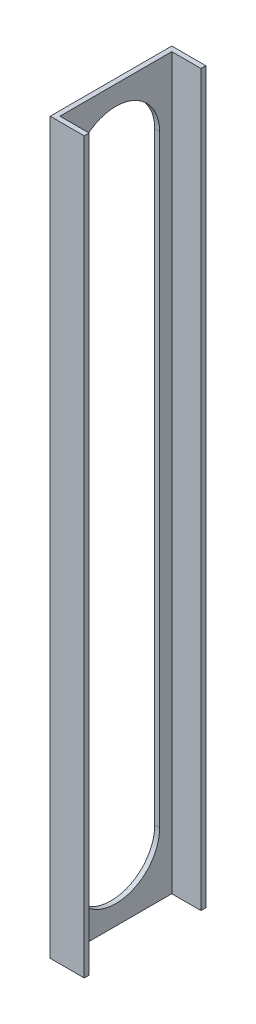
ISO-10303-21;
HEADER;
FILE_DESCRIPTION(('STEP AP214'),'2;1');
FILE_NAME('part.step','',(''),(''),'','','');
FILE_SCHEMA(('AUTOMOTIVE_DESIGN { 1 0 10303 214 1 1 1 1 }'));
ENDSEC;
DATA;
#1=APPLICATION_CONTEXT('core data for automotive mechanical design processes');
#2=APPLICATION_PROTOCOL_DEFINITION('international standard','automotive_design',2000,#1);
#3=PRODUCT_CONTEXT('',#1,'mechanical');
#4=PRODUCT('Part','Part','',(#3));
#5=PRODUCT_RELATED_PRODUCT_CATEGORY('part','',(#4));
#6=PRODUCT_DEFINITION_FORMATION('','',#4);
#7=PRODUCT_DEFINITION_CONTEXT('part definition',#1,'design');
#8=PRODUCT_DEFINITION('design','',#6,#7);
#9=PRODUCT_DEFINITION_SHAPE('','',#8);
#10=(LENGTH_UNIT() NAMED_UNIT(*) SI_UNIT(.MILLI.,.METRE.));
#11=(NAMED_UNIT(*) PLANE_ANGLE_UNIT() SI_UNIT($,.RADIAN.));
#12=(NAMED_UNIT(*) SI_UNIT($,.STERADIAN.) SOLID_ANGLE_UNIT());
#13=UNCERTAINTY_MEASURE_WITH_UNIT(LENGTH_MEASURE(1.E-05),#10,'distance_accuracy_value','');
#14=(GEOMETRIC_REPRESENTATION_CONTEXT(3) GLOBAL_UNCERTAINTY_ASSIGNED_CONTEXT((#13)) GLOBAL_UNIT_ASSIGNED_CONTEXT((#10,
#11,#12)) REPRESENTATION_CONTEXT('',''));
#15=CARTESIAN_POINT('',(0.,0.,0.));
#16=DIRECTION('',(0.,0.,1.));
#17=DIRECTION('',(1.,0.,0.));
#18=AXIS2_PLACEMENT_3D('',#15,#16,#17);
#19=CARTESIAN_POINT('',(0.,300.,0.));
#20=DIRECTION('',(0.,0.,-1.));
#21=DIRECTION('',(-1.,0.,0.));
#22=AXIS2_PLACEMENT_3D('',#19,#20,#21);
#23=PLANE('',#22);
#24=DIRECTION('',(1.,0.,0.));
#25=VECTOR('',#24,1.);
#26=CARTESIAN_POINT('',(0.,0.,0.));
#27=LINE('',#26,#25);
#28=CARTESIAN_POINT('',(0.,0.,0.));
#29=VERTEX_POINT('',#28);
#30=CARTESIAN_POINT('',(14.,0.,0.));
#31=VERTEX_POINT('',#30);
#32=EDGE_CURVE('E160',#29,#31,#27,.T.);
#33=ORIENTED_EDGE('',*,*,#32,.T.);
#34=DIRECTION('',(0.,-1.,0.));
#35=VECTOR('',#34,1.);
#36=CARTESIAN_POINT('',(14.,300.,0.));
#37=LINE('',#36,#35);
#38=CARTESIAN_POINT('',(14.,300.,0.));
#39=VERTEX_POINT('',#38);
#40=EDGE_CURVE('E11',#39,#31,#37,.T.);
#41=ORIENTED_EDGE('',*,*,#40,.F.);
#42=DIRECTION('',(1.,0.,0.));
#43=VECTOR('',#42,1.);
#44=CARTESIAN_POINT('',(0.,300.,0.));
#45=LINE('',#44,#43);
#46=CARTESIAN_POINT('',(0.,300.,0.));
#47=VERTEX_POINT('',#46);
#48=EDGE_CURVE('E161',#47,#39,#45,.T.);
#49=ORIENTED_EDGE('',*,*,#48,.F.);
#50=DIRECTION('',(0.,-1.,0.));
#51=VECTOR('',#50,1.);
#52=CARTESIAN_POINT('',(0.,300.,0.));
#53=LINE('',#52,#51);
#54=EDGE_CURVE('E179',#47,#29,#53,.T.);
#55=ORIENTED_EDGE('',*,*,#54,.T.);
#56=EDGE_LOOP('',(#33,#41,#49,#55));
#57=FACE_BOUND('',#56,.T.);
#58=ADVANCED_FACE('F35',(#57),#23,.F.);
#59=CARTESIAN_POINT('',(14.,300.,-2.));
#60=DIRECTION('',(-1.,0.,0.));
#61=DIRECTION('',(0.,0.,1.));
#62=AXIS2_PLACEMENT_3D('',#59,#60,#61);
#63=PLANE('',#62);
#64=DIRECTION('',(0.,0.,-1.));
#65=VECTOR('',#64,1.);
#66=CARTESIAN_POINT('',(14.,0.,-2.));
#67=LINE('',#66,#65);
#68=CARTESIAN_POINT('',(14.,0.,-2.));
#69=VERTEX_POINT('',#68);
#70=EDGE_CURVE('E182',#31,#69,#67,.T.);
#71=ORIENTED_EDGE('',*,*,#70,.T.);
#72=DIRECTION('',(0.,-1.,0.));
#73=VECTOR('',#72,1.);
#74=CARTESIAN_POINT('',(14.,300.,-2.));
#75=LINE('',#74,#73);
#76=CARTESIAN_POINT('',(14.,300.,-2.));
#77=VERTEX_POINT('',#76);
#78=EDGE_CURVE('E42',#77,#69,#75,.T.);
#79=ORIENTED_EDGE('',*,*,#78,.F.);
#80=DIRECTION('',(0.,0.,-1.));
#81=VECTOR('',#80,1.);
#82=CARTESIAN_POINT('',(14.,300.,-2.));
#83=LINE('',#82,#81);
#84=EDGE_CURVE('E164',#39,#77,#83,.T.);
#85=ORIENTED_EDGE('',*,*,#84,.F.);
#86=ORIENTED_EDGE('',*,*,#40,.T.);
#87=EDGE_LOOP('',(#71,#79,#85,#86));
#88=FACE_BOUND('',#87,.T.);
#89=ADVANCED_FACE('F239',(#88),#63,.F.);
#90=CARTESIAN_POINT('',(2.,300.,-2.));
#91=DIRECTION('',(0.,0.,1.));
#92=DIRECTION('',(1.,0.,0.));
#93=AXIS2_PLACEMENT_3D('',#90,#91,#92);
#94=PLANE('',#93);
#95=DIRECTION('',(-1.,0.,0.));
#96=VECTOR('',#95,1.);
#97=CARTESIAN_POINT('',(2.,0.,-2.));
#98=LINE('',#97,#96);
#99=CARTESIAN_POINT('',(2.,0.,-2.));
#100=VERTEX_POINT('',#99);
#101=EDGE_CURVE('E184',#69,#100,#98,.T.);
#102=ORIENTED_EDGE('',*,*,#101,.T.);
#103=DIRECTION('',(0.,-1.,0.));
#104=VECTOR('',#103,1.);
#105=CARTESIAN_POINT('',(2.,300.,-2.));
#106=LINE('',#105,#104);
#107=CARTESIAN_POINT('',(2.,300.,-2.));
#108=VERTEX_POINT('',#107);
#109=EDGE_CURVE('E209',#108,#100,#106,.T.);
#110=ORIENTED_EDGE('',*,*,#109,.F.);
#111=DIRECTION('',(-1.,0.,0.));
#112=VECTOR('',#111,1.);
#113=CARTESIAN_POINT('',(2.,300.,-2.));
#114=LINE('',#113,#112);
#115=EDGE_CURVE('E167',#77,#108,#114,.T.);
#116=ORIENTED_EDGE('',*,*,#115,.F.);
#117=ORIENTED_EDGE('',*,*,#78,.T.);
#118=EDGE_LOOP('',(#102,#110,#116,#117));
#119=FACE_BOUND('',#118,.T.);
#120=ADVANCED_FACE('F216',(#119),#94,.F.);
#121=CARTESIAN_POINT('',(2.,300.,-2.));
#122=DIRECTION('',(-1.,0.,0.));
#123=DIRECTION('',(0.,0.,1.));
#124=AXIS2_PLACEMENT_3D('',#121,#122,#123);
#125=PLANE('',#124);
#126=DIRECTION('',(0.,1.,0.));
#127=VECTOR('',#126,1.);
#128=CARTESIAN_POINT('',(2.,300.,-7.00000000000001));
#129=LINE('',#128,#127);
#130=CARTESIAN_POINT('',(2.,26.,-6.99999999999997));
#131=VERTEX_POINT('',#130);
#132=CARTESIAN_POINT('',(2.,274.,-7.00000000000001));
#133=VERTEX_POINT('',#132);
#134=EDGE_CURVE('E154',#131,#133,#129,.T.);
#135=ORIENTED_EDGE('',*,*,#134,.T.);
#136=CARTESIAN_POINT('',(2.,274.,-25.));
#137=DIRECTION('',(-1.,0.,0.));
#138=DIRECTION('',(0.,0.,1.));
#139=AXIS2_PLACEMENT_3D('',#136,#137,#138);
#140=CIRCLE('',#139,18.);
#141=CARTESIAN_POINT('',(2.,274.,-43.));
#142=VERTEX_POINT('',#141);
#143=EDGE_CURVE('E157',#133,#142,#140,.T.);
#144=ORIENTED_EDGE('',*,*,#143,.T.);
#145=DIRECTION('',(0.,-1.,0.));
#146=VECTOR('',#145,1.);
#147=CARTESIAN_POINT('',(2.,300.,-43.));
#148=LINE('',#147,#146);
#149=CARTESIAN_POINT('',(2.,26.,-43.));
#150=VERTEX_POINT('',#149);
#151=EDGE_CURVE('E149',#142,#150,#148,.T.);
#152=ORIENTED_EDGE('',*,*,#151,.T.);
#153=CARTESIAN_POINT('',(2.,26.,-25.));
#154=DIRECTION('',(-1.,0.,0.));
#155=DIRECTION('',(0.,0.,1.));
#156=AXIS2_PLACEMENT_3D('',#153,#154,#155);
#157=CIRCLE('',#156,18.);
#158=EDGE_CURVE('E129',#150,#131,#157,.T.);
#159=ORIENTED_EDGE('',*,*,#158,.T.);
#160=EDGE_LOOP('',(#135,#144,#152,#159));
#161=FACE_BOUND('',#160,.T.);
#162=DIRECTION('',(0.,0.,-1.));
#163=VECTOR('',#162,1.);
#164=CARTESIAN_POINT('',(2.,0.,-2.));
#165=LINE('',#164,#163);
#166=CARTESIAN_POINT('',(2.,0.,-48.));
#167=VERTEX_POINT('',#166);
#168=EDGE_CURVE('E186',#100,#167,#165,.T.);
#169=ORIENTED_EDGE('',*,*,#168,.T.);
#170=DIRECTION('',(0.,-1.,0.));
#171=VECTOR('',#170,1.);
#172=CARTESIAN_POINT('',(2.,300.,-48.));
#173=LINE('',#172,#171);
#174=CARTESIAN_POINT('',(2.,300.,-48.));
#175=VERTEX_POINT('',#174);
#176=EDGE_CURVE('E206',#175,#167,#173,.T.);
#177=ORIENTED_EDGE('',*,*,#176,.F.);
#178=DIRECTION('',(0.,0.,-1.));
#179=VECTOR('',#178,1.);
#180=CARTESIAN_POINT('',(2.,300.,-2.));
#181=LINE('',#180,#179);
#182=EDGE_CURVE('E169',#108,#175,#181,.T.);
#183=ORIENTED_EDGE('',*,*,#182,.F.);
#184=ORIENTED_EDGE('',*,*,#109,.T.);
#185=EDGE_LOOP('',(#169,#177,#183,#184));
#186=FACE_BOUND('',#185,.T.);
#187=ADVANCED_FACE('F227',(#161,#186),#125,.F.);
#188=CARTESIAN_POINT('',(2.,300.,-48.));
#189=DIRECTION('',(0.,0.,-1.));
#190=DIRECTION('',(-1.,0.,0.));
#191=AXIS2_PLACEMENT_3D('',#188,#189,#190);
#192=PLANE('',#191);
#193=DIRECTION('',(1.,0.,0.));
#194=VECTOR('',#193,1.);
#195=CARTESIAN_POINT('',(2.,0.,-48.));
#196=LINE('',#195,#194);
#197=CARTESIAN_POINT('',(14.,0.,-48.));
#198=VERTEX_POINT('',#197);
#199=EDGE_CURVE('E188',#167,#198,#196,.T.);
#200=ORIENTED_EDGE('',*,*,#199,.T.);
#201=DIRECTION('',(0.,-1.,0.));
#202=VECTOR('',#201,1.);
#203=CARTESIAN_POINT('',(14.,300.,-48.));
#204=LINE('',#203,#202);
#205=CARTESIAN_POINT('',(14.,300.,-48.));
#206=VERTEX_POINT('',#205);
#207=EDGE_CURVE('E203',#206,#198,#204,.T.);
#208=ORIENTED_EDGE('',*,*,#207,.F.);
#209=DIRECTION('',(1.,0.,0.));
#210=VECTOR('',#209,1.);
#211=CARTESIAN_POINT('',(2.,300.,-48.));
#212=LINE('',#211,#210);
#213=EDGE_CURVE('E171',#175,#206,#212,.T.);
#214=ORIENTED_EDGE('',*,*,#213,.F.);
#215=ORIENTED_EDGE('',*,*,#176,.T.);
#216=EDGE_LOOP('',(#200,#208,#214,#215));
#217=FACE_BOUND('',#216,.T.);
#218=ADVANCED_FACE('F231',(#217),#192,.F.);
#219=CARTESIAN_POINT('',(14.,300.,-50.));
#220=DIRECTION('',(-1.,0.,0.));
#221=DIRECTION('',(0.,0.,1.));
#222=AXIS2_PLACEMENT_3D('',#219,#220,#221);
#223=PLANE('',#222);
#224=DIRECTION('',(0.,0.,-1.));
#225=VECTOR('',#224,1.);
#226=CARTESIAN_POINT('',(14.,0.,-50.));
#227=LINE('',#226,#225);
#228=CARTESIAN_POINT('',(14.,0.,-50.));
#229=VERTEX_POINT('',#228);
#230=EDGE_CURVE('E190',#198,#229,#227,.T.);
#231=ORIENTED_EDGE('',*,*,#230,.T.);
#232=DIRECTION('',(0.,-1.,0.));
#233=VECTOR('',#232,1.);
#234=CARTESIAN_POINT('',(14.,300.,-50.));
#235=LINE('',#234,#233);
#236=CARTESIAN_POINT('',(14.,300.,-50.));
#237=VERTEX_POINT('',#236);
#238=EDGE_CURVE('E200',#237,#229,#235,.T.);
#239=ORIENTED_EDGE('',*,*,#238,.F.);
#240=DIRECTION('',(0.,0.,-1.));
#241=VECTOR('',#240,1.);
#242=CARTESIAN_POINT('',(14.,300.,-50.));
#243=LINE('',#242,#241);
#244=EDGE_CURVE('E173',#206,#237,#243,.T.);
#245=ORIENTED_EDGE('',*,*,#244,.F.);
#246=ORIENTED_EDGE('',*,*,#207,.T.);
#247=EDGE_LOOP('',(#231,#239,#245,#246));
#248=FACE_BOUND('',#247,.T.);
#249=ADVANCED_FACE('F250',(#248),#223,.F.);
#250=CARTESIAN_POINT('',(0.,300.,-50.));
#251=DIRECTION('',(0.,0.,1.));
#252=DIRECTION('',(1.,0.,0.));
#253=AXIS2_PLACEMENT_3D('',#250,#251,#252);
#254=PLANE('',#253);
#255=DIRECTION('',(-1.,0.,0.));
#256=VECTOR('',#255,1.);
#257=CARTESIAN_POINT('',(0.,0.,-50.));
#258=LINE('',#257,#256);
#259=CARTESIAN_POINT('',(0.,0.,-50.));
#260=VERTEX_POINT('',#259);
#261=EDGE_CURVE('E192',#229,#260,#258,.T.);
#262=ORIENTED_EDGE('',*,*,#261,.T.);
#263=DIRECTION('',(0.,-1.,0.));
#264=VECTOR('',#263,1.);
#265=CARTESIAN_POINT('',(0.,300.,-50.));
#266=LINE('',#265,#264);
#267=CARTESIAN_POINT('',(0.,300.,-50.));
#268=VERTEX_POINT('',#267);
#269=EDGE_CURVE('E197',#268,#260,#266,.T.);
#270=ORIENTED_EDGE('',*,*,#269,.F.);
#271=DIRECTION('',(-1.,0.,0.));
#272=VECTOR('',#271,1.);
#273=CARTESIAN_POINT('',(0.,300.,-50.));
#274=LINE('',#273,#272);
#275=EDGE_CURVE('E175',#237,#268,#274,.T.);
#276=ORIENTED_EDGE('',*,*,#275,.F.);
#277=ORIENTED_EDGE('',*,*,#238,.T.);
#278=EDGE_LOOP('',(#262,#270,#276,#277));
#279=FACE_BOUND('',#278,.T.);
#280=ADVANCED_FACE('F248',(#279),#254,.F.);
#281=CARTESIAN_POINT('',(0.,300.,0.));
#282=DIRECTION('',(1.,0.,0.));
#283=DIRECTION('',(0.,0.,-1.));
#284=AXIS2_PLACEMENT_3D('',#281,#282,#283);
#285=PLANE('',#284);
#286=DIRECTION('',(0.,-1.,0.));
#287=VECTOR('',#286,1.);
#288=CARTESIAN_POINT('',(0.,274.,-43.));
#289=LINE('',#288,#287);
#290=CARTESIAN_POINT('',(0.,274.,-43.));
#291=VERTEX_POINT('',#290);
#292=CARTESIAN_POINT('',(0.,26.,-43.));
#293=VERTEX_POINT('',#292);
#294=EDGE_CURVE('E135',#291,#293,#289,.T.);
#295=ORIENTED_EDGE('',*,*,#294,.F.);
#296=CARTESIAN_POINT('',(0.,274.,-25.));
#297=DIRECTION('',(-1.,0.,0.));
#298=DIRECTION('',(0.,0.,1.));
#299=AXIS2_PLACEMENT_3D('',#296,#297,#298);
#300=CIRCLE('',#299,18.);
#301=CARTESIAN_POINT('',(0.,274.,-7.00000000000001));
#302=VERTEX_POINT('',#301);
#303=EDGE_CURVE('E57',#302,#291,#300,.T.);
#304=ORIENTED_EDGE('',*,*,#303,.F.);
#305=DIRECTION('',(0.,1.,0.));
#306=VECTOR('',#305,1.);
#307=CARTESIAN_POINT('',(0.,274.,-7.00000000000001));
#308=LINE('',#307,#306);
#309=CARTESIAN_POINT('',(0.,26.,-6.99999999999997));
#310=VERTEX_POINT('',#309);
#311=EDGE_CURVE('E142',#310,#302,#308,.T.);
#312=ORIENTED_EDGE('',*,*,#311,.F.);
#313=CARTESIAN_POINT('',(0.,26.,-25.));
#314=DIRECTION('',(-1.,0.,0.));
#315=DIRECTION('',(0.,0.,1.));
#316=AXIS2_PLACEMENT_3D('',#313,#314,#315);
#317=CIRCLE('',#316,18.);
#318=EDGE_CURVE('E126',#293,#310,#317,.T.);
#319=ORIENTED_EDGE('',*,*,#318,.F.);
#320=EDGE_LOOP('',(#295,#304,#312,#319));
#321=FACE_BOUND('',#320,.T.);
#322=DIRECTION('',(0.,0.,1.));
#323=VECTOR('',#322,1.);
#324=CARTESIAN_POINT('',(0.,0.,0.));
#325=LINE('',#324,#323);
#326=EDGE_CURVE('E165',#260,#29,#325,.T.);
#327=ORIENTED_EDGE('',*,*,#326,.T.);
#328=ORIENTED_EDGE('',*,*,#54,.F.);
#329=DIRECTION('',(0.,0.,1.));
#330=VECTOR('',#329,1.);
#331=CARTESIAN_POINT('',(0.,300.,0.));
#332=LINE('',#331,#330);
#333=EDGE_CURVE('E177',#268,#47,#332,.T.);
#334=ORIENTED_EDGE('',*,*,#333,.F.);
#335=ORIENTED_EDGE('',*,*,#269,.T.);
#336=EDGE_LOOP('',(#327,#328,#334,#335));
#337=FACE_BOUND('',#336,.T.);
#338=ADVANCED_FACE('F139',(#321,#337),#285,.F.);
#339=CARTESIAN_POINT('',(0.,300.,0.));
#340=DIRECTION('',(0.,-1.,0.));
#341=DIRECTION('',(0.,0.,-1.));
#342=AXIS2_PLACEMENT_3D('',#339,#340,#341);
#343=PLANE('',#342);
#344=ORIENTED_EDGE('',*,*,#48,.T.);
#345=ORIENTED_EDGE('',*,*,#84,.T.);
#346=ORIENTED_EDGE('',*,*,#115,.T.);
#347=ORIENTED_EDGE('',*,*,#182,.T.);
#348=ORIENTED_EDGE('',*,*,#213,.T.);
#349=ORIENTED_EDGE('',*,*,#244,.T.);
#350=ORIENTED_EDGE('',*,*,#275,.T.);
#351=ORIENTED_EDGE('',*,*,#333,.T.);
#352=EDGE_LOOP('',(#344,#345,#346,#347,#348,#349,#350,#351));
#353=FACE_BOUND('',#352,.T.);
#354=ADVANCED_FACE('F235',(#353),#343,.F.);
#355=CARTESIAN_POINT('',(0.,0.,0.));
#356=DIRECTION('',(0.,-1.,0.));
#357=DIRECTION('',(0.,0.,-1.));
#358=AXIS2_PLACEMENT_3D('',#355,#356,#357);
#359=PLANE('',#358);
#360=ORIENTED_EDGE('',*,*,#32,.F.);
#361=ORIENTED_EDGE('',*,*,#326,.F.);
#362=ORIENTED_EDGE('',*,*,#261,.F.);
#363=ORIENTED_EDGE('',*,*,#230,.F.);
#364=ORIENTED_EDGE('',*,*,#199,.F.);
#365=ORIENTED_EDGE('',*,*,#168,.F.);
#366=ORIENTED_EDGE('',*,*,#101,.F.);
#367=ORIENTED_EDGE('',*,*,#70,.F.);
#368=EDGE_LOOP('',(#360,#361,#362,#363,#364,#365,#366,#367));
#369=FACE_BOUND('',#368,.T.);
#370=ADVANCED_FACE('F222',(#369),#359,.T.);
#371=CARTESIAN_POINT('',(14.,274.,-25.));
#372=DIRECTION('',(-1.,0.,0.));
#373=DIRECTION('',(0.,0.,1.));
#374=AXIS2_PLACEMENT_3D('',#371,#372,#373);
#375=CYLINDRICAL_SURFACE('',#374,18.);
#376=DIRECTION('',(-1.,0.,0.));
#377=VECTOR('',#376,1.);
#378=CARTESIAN_POINT('',(14.,274.,-7.00000000000001));
#379=LINE('',#378,#377);
#380=EDGE_CURVE('E147',#133,#302,#379,.T.);
#381=ORIENTED_EDGE('',*,*,#380,.T.);
#382=ORIENTED_EDGE('',*,*,#303,.T.);
#383=DIRECTION('',(-1.,0.,0.));
#384=VECTOR('',#383,1.);
#385=CARTESIAN_POINT('',(14.,274.,-43.));
#386=LINE('',#385,#384);
#387=EDGE_CURVE('E132',#142,#291,#386,.T.);
#388=ORIENTED_EDGE('',*,*,#387,.F.);
#389=ORIENTED_EDGE('',*,*,#143,.F.);
#390=EDGE_LOOP('',(#381,#382,#388,#389));
#391=FACE_BOUND('',#390,.T.);
#392=ADVANCED_FACE('F275',(#391),#375,.F.);
#393=CARTESIAN_POINT('',(14.,274.,-7.00000000000001));
#394=DIRECTION('',(0.,0.,1.));
#395=DIRECTION('',(0.,-1.,0.));
#396=AXIS2_PLACEMENT_3D('',#393,#394,#395);
#397=PLANE('',#396);
#398=DIRECTION('',(-1.,0.,0.));
#399=VECTOR('',#398,1.);
#400=CARTESIAN_POINT('',(14.,26.,-6.99999999999997));
#401=LINE('',#400,#399);
#402=EDGE_CURVE('E131',#131,#310,#401,.T.);
#403=ORIENTED_EDGE('',*,*,#402,.T.);
#404=ORIENTED_EDGE('',*,*,#311,.T.);
#405=ORIENTED_EDGE('',*,*,#380,.F.);
#406=ORIENTED_EDGE('',*,*,#134,.F.);
#407=EDGE_LOOP('',(#403,#404,#405,#406));
#408=FACE_BOUND('',#407,.T.);
#409=ADVANCED_FACE('F274',(#408),#397,.F.);
#410=CARTESIAN_POINT('',(14.,26.,-25.));
#411=DIRECTION('',(-1.,0.,0.));
#412=DIRECTION('',(0.,0.,1.));
#413=AXIS2_PLACEMENT_3D('',#410,#411,#412);
#414=CYLINDRICAL_SURFACE('',#413,18.);
#415=DIRECTION('',(-1.,0.,0.));
#416=VECTOR('',#415,1.);
#417=CARTESIAN_POINT('',(14.,26.,-43.));
#418=LINE('',#417,#416);
#419=EDGE_CURVE('E49',#150,#293,#418,.T.);
#420=ORIENTED_EDGE('',*,*,#419,.T.);
#421=ORIENTED_EDGE('',*,*,#318,.T.);
#422=ORIENTED_EDGE('',*,*,#402,.F.);
#423=ORIENTED_EDGE('',*,*,#158,.F.);
#424=EDGE_LOOP('',(#420,#421,#422,#423));
#425=FACE_BOUND('',#424,.T.);
#426=ADVANCED_FACE('F123',(#425),#414,.F.);
#427=CARTESIAN_POINT('',(14.,274.,-43.));
#428=DIRECTION('',(0.,0.,-1.));
#429=DIRECTION('',(0.,1.,0.));
#430=AXIS2_PLACEMENT_3D('',#427,#428,#429);
#431=PLANE('',#430);
#432=ORIENTED_EDGE('',*,*,#387,.T.);
#433=ORIENTED_EDGE('',*,*,#294,.T.);
#434=ORIENTED_EDGE('',*,*,#419,.F.);
#435=ORIENTED_EDGE('',*,*,#151,.F.);
#436=EDGE_LOOP('',(#432,#433,#434,#435));
#437=FACE_BOUND('',#436,.T.);
#438=ADVANCED_FACE('F136',(#437),#431,.F.);
#439=CLOSED_SHELL('',(#58,#89,#120,#187,#218,#249,#280,#338,#354,#370,#392,#409,#426,#438));
#440=MANIFOLD_SOLID_BREP('B2',#439);
#441=ADVANCED_BREP_SHAPE_REPRESENTATION('',(#18,#440),#14);
#442=SHAPE_DEFINITION_REPRESENTATION(#9,#441);
ENDSEC;
END-ISO-10303-21;
